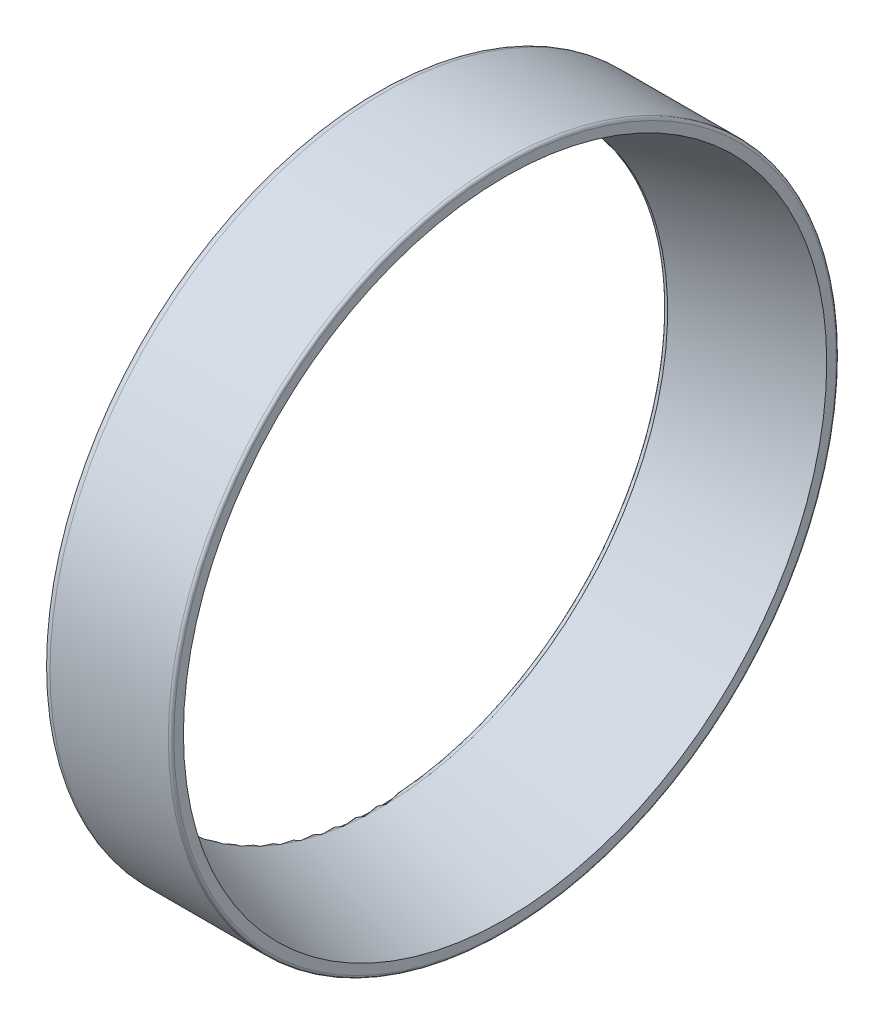
ISO-10303-21;
HEADER;
FILE_DESCRIPTION(('STEP AP214'),'2;1');
FILE_NAME('part.step','',(''),(''),'','','');
FILE_SCHEMA(('AUTOMOTIVE_DESIGN { 1 0 10303 214 1 1 1 1 }'));
ENDSEC;
DATA;
#1=APPLICATION_CONTEXT('core data for automotive mechanical design processes');
#2=APPLICATION_PROTOCOL_DEFINITION('international standard','automotive_design',2000,#1);
#3=PRODUCT_CONTEXT('',#1,'mechanical');
#4=PRODUCT('Part','Part','',(#3));
#5=PRODUCT_RELATED_PRODUCT_CATEGORY('part','',(#4));
#6=PRODUCT_DEFINITION_FORMATION('','',#4);
#7=PRODUCT_DEFINITION_CONTEXT('part definition',#1,'design');
#8=PRODUCT_DEFINITION('design','',#6,#7);
#9=PRODUCT_DEFINITION_SHAPE('','',#8);
#10=(LENGTH_UNIT() NAMED_UNIT(*) SI_UNIT(.MILLI.,.METRE.));
#11=(NAMED_UNIT(*) PLANE_ANGLE_UNIT() SI_UNIT($,.RADIAN.));
#12=(NAMED_UNIT(*) SI_UNIT($,.STERADIAN.) SOLID_ANGLE_UNIT());
#13=UNCERTAINTY_MEASURE_WITH_UNIT(LENGTH_MEASURE(1.E-05),#10,'distance_accuracy_value','');
#14=(GEOMETRIC_REPRESENTATION_CONTEXT(3) GLOBAL_UNCERTAINTY_ASSIGNED_CONTEXT((#13)) GLOBAL_UNIT_ASSIGNED_CONTEXT((#10,
#11,#12)) REPRESENTATION_CONTEXT('',''));
#15=CARTESIAN_POINT('',(0.,0.,0.));
#16=DIRECTION('',(0.,0.,1.));
#17=DIRECTION('',(1.,0.,0.));
#18=AXIS2_PLACEMENT_3D('',#15,#16,#17);
#19=CARTESIAN_POINT('',(0.,-39.4321371313023,-39.));
#20=DIRECTION('',(-1.,0.,0.));
#21=DIRECTION('',(0.,0.,1.));
#22=AXIS2_PLACEMENT_3D('',#19,#20,#21);
#23=PLANE('',#22);
#24=CARTESIAN_POINT('',(0.,0.,0.));
#25=DIRECTION('',(-1.,0.,0.));
#26=DIRECTION('',(0.,0.,-1.));
#27=AXIS2_PLACEMENT_3D('',#24,#25,#26);
#28=CIRCLE('',#27,39.);
#29=CARTESIAN_POINT('',(0.,0.,-39.));
#30=VERTEX_POINT('',#29);
#31=EDGE_CURVE('E40',#30,#30,#28,.F.);
#32=ORIENTED_EDGE('',*,*,#31,.F.);
#33=EDGE_LOOP('',(#32));
#34=FACE_BOUND('',#33,.T.);
#35=CARTESIAN_POINT('',(0.,0.,0.));
#36=DIRECTION('',(1.,0.,0.));
#37=DIRECTION('',(0.,-1.16851181600663E-09,1.));
#38=AXIS2_PLACEMENT_3D('',#35,#36,#37);
#39=CIRCLE('',#38,34.8130861010915);
#40=CARTESIAN_POINT('',(0.,-4.06795024607815E-08,34.8130861010915));
#41=VERTEX_POINT('',#40);
#42=EDGE_CURVE('E37',#41,#41,#39,.T.);
#43=ORIENTED_EDGE('',*,*,#42,.T.);
#44=EDGE_LOOP('',(#43));
#45=FACE_BOUND('',#44,.T.);
#46=ADVANCED_FACE('F14',(#34,#45),#23,.T.);
#47=CARTESIAN_POINT('',(15.5,-40.1061907178724,39.666666666667));
#48=DIRECTION('',(1.,0.,0.));
#49=DIRECTION('',(0.,0.,-1.));
#50=AXIS2_PLACEMENT_3D('',#47,#48,#49);
#51=PLANE('',#50);
#52=CARTESIAN_POINT('',(15.5,0.,0.));
#53=DIRECTION('',(1.,0.,0.));
#54=DIRECTION('',(0.,-1.16854371557213E-09,1.));
#55=AXIS2_PLACEMENT_3D('',#52,#53,#54);
#56=CIRCLE('',#55,39.6666667637462);
#57=CARTESIAN_POINT('',(15.5,-4.63522341644694E-08,39.6666667637462));
#58=VERTEX_POINT('',#57);
#59=EDGE_CURVE('E34',#58,#58,#56,.T.);
#60=ORIENTED_EDGE('',*,*,#59,.T.);
#61=EDGE_LOOP('',(#60));
#62=FACE_BOUND('',#61,.T.);
#63=CARTESIAN_POINT('',(15.5,0.,0.));
#64=DIRECTION('',(-1.,0.,0.));
#65=DIRECTION('',(0.,0.,-1.));
#66=AXIS2_PLACEMENT_3D('',#63,#64,#65);
#67=CIRCLE('',#66,38.524018921676);
#68=CARTESIAN_POINT('',(15.5,0.,-38.524018921676));
#69=VERTEX_POINT('',#68);
#70=EDGE_CURVE('E29',#69,#69,#67,.F.);
#71=ORIENTED_EDGE('',*,*,#70,.F.);
#72=EDGE_LOOP('',(#71));
#73=FACE_BOUND('',#72,.T.);
#74=ADVANCED_FACE('F48',(#62,#73),#51,.T.);
#75=CARTESIAN_POINT('',(0.500000000000648,0.,0.));
#76=DIRECTION('',(1.,0.,0.));
#77=DIRECTION('',(0.,0.,1.));
#78=AXIS2_PLACEMENT_3D('',#75,#76,#77);
#79=TOROIDAL_SURFACE('',#78,34.8130860775307,0.500000000000648);
#80=ORIENTED_EDGE('',*,*,#42,.F.);
#81=EDGE_LOOP('',(#80));
#82=FACE_BOUND('',#81,.T.);
#83=CARTESIAN_POINT('',(0.635720224932537,0.,0.));
#84=DIRECTION('',(1.,0.,0.));
#85=DIRECTION('',(0.,0.,1.));
#86=AXIS2_PLACEMENT_3D('',#83,#84,#85);
#87=CIRCLE('',#86,34.331858459303);
#88=CARTESIAN_POINT('',(0.635720224932537,0.,34.331858459303));
#89=VERTEX_POINT('',#88);
#90=EDGE_CURVE('E25',#89,#89,#87,.T.);
#91=ORIENTED_EDGE('',*,*,#90,.T.);
#92=EDGE_LOOP('',(#91));
#93=FACE_BOUND('',#92,.T.);
#94=ADVANCED_FACE('F52',(#82,#93),#79,.T.);
#95=CARTESIAN_POINT('',(15.5,0.,0.));
#96=DIRECTION('',(1.,0.,0.));
#97=DIRECTION('',(0.,0.,1.));
#98=AXIS2_PLACEMENT_3D('',#95,#96,#97);
#99=CONICAL_SURFACE('',#98,38.524018921676,0.274889357189119);
#100=ORIENTED_EDGE('',*,*,#70,.T.);
#101=EDGE_LOOP('',(#100));
#102=FACE_BOUND('',#101,.T.);
#103=ORIENTED_EDGE('',*,*,#90,.F.);
#104=EDGE_LOOP('',(#103));
#105=FACE_BOUND('',#104,.T.);
#106=ADVANCED_FACE('F55',(#102,#105),#99,.F.);
#107=CARTESIAN_POINT('',(15.166666666666,0.,0.));
#108=DIRECTION('',(1.,0.,0.));
#109=DIRECTION('',(0.,0.,1.));
#110=AXIS2_PLACEMENT_3D('',#107,#108,#109);
#111=TOROIDAL_SURFACE('',#110,39.6666666666661,0.333333333333964);
#112=CARTESIAN_POINT('',(15.166666666666,0.,0.));
#113=DIRECTION('',(1.,0.,0.));
#114=DIRECTION('',(0.,0.,1.));
#115=AXIS2_PLACEMENT_3D('',#112,#113,#114);
#116=CIRCLE('',#115,40.);
#117=CARTESIAN_POINT('',(15.166666666666,0.,40.));
#118=VERTEX_POINT('',#117);
#119=EDGE_CURVE('E21',#118,#118,#116,.T.);
#120=ORIENTED_EDGE('',*,*,#119,.T.);
#121=EDGE_LOOP('',(#120));
#122=FACE_BOUND('',#121,.T.);
#123=ORIENTED_EDGE('',*,*,#59,.F.);
#124=EDGE_LOOP('',(#123));
#125=FACE_BOUND('',#124,.T.);
#126=ADVANCED_FACE('F60',(#122,#125),#111,.T.);
#127=CARTESIAN_POINT('',(15.5,0.,0.));
#128=DIRECTION('',(1.,0.,0.));
#129=DIRECTION('',(0.,0.,1.));
#130=AXIS2_PLACEMENT_3D('',#127,#128,#129);
#131=CYLINDRICAL_SURFACE('',#130,40.);
#132=CARTESIAN_POINT('',(1.,0.,0.));
#133=DIRECTION('',(1.,0.,0.));
#134=DIRECTION('',(0.,0.,1.));
#135=AXIS2_PLACEMENT_3D('',#132,#133,#134);
#136=CIRCLE('',#135,40.);
#137=CARTESIAN_POINT('',(1.,0.,40.));
#138=VERTEX_POINT('',#137);
#139=EDGE_CURVE('E10',#138,#138,#136,.T.);
#140=ORIENTED_EDGE('',*,*,#139,.T.);
#141=EDGE_LOOP('',(#140));
#142=FACE_BOUND('',#141,.T.);
#143=ORIENTED_EDGE('',*,*,#119,.F.);
#144=EDGE_LOOP('',(#143));
#145=FACE_BOUND('',#144,.T.);
#146=ADVANCED_FACE('F67',(#142,#145),#131,.T.);
#147=CARTESIAN_POINT('',(0.999999999999218,0.,0.));
#148=DIRECTION('',(1.,0.,0.));
#149=DIRECTION('',(0.,1.16832911157425E-09,1.));
#150=AXIS2_PLACEMENT_3D('',#147,#148,#149);
#151=TOROIDAL_SURFACE('',#150,39.0000000000008,0.999999999999217);
#152=ORIENTED_EDGE('',*,*,#31,.T.);
#153=EDGE_LOOP('',(#152));
#154=FACE_BOUND('',#153,.T.);
#155=ORIENTED_EDGE('',*,*,#139,.F.);
#156=EDGE_LOOP('',(#155));
#157=FACE_BOUND('',#156,.T.);
#158=ADVANCED_FACE('F16',(#154,#157),#151,.T.);
#159=CLOSED_SHELL('',(#46,#74,#94,#106,#126,#146,#158));
#160=MANIFOLD_SOLID_BREP('B1',#159);
#161=ADVANCED_BREP_SHAPE_REPRESENTATION('',(#18,#160),#14);
#162=SHAPE_DEFINITION_REPRESENTATION(#9,#161);
ENDSEC;
END-ISO-10303-21;
